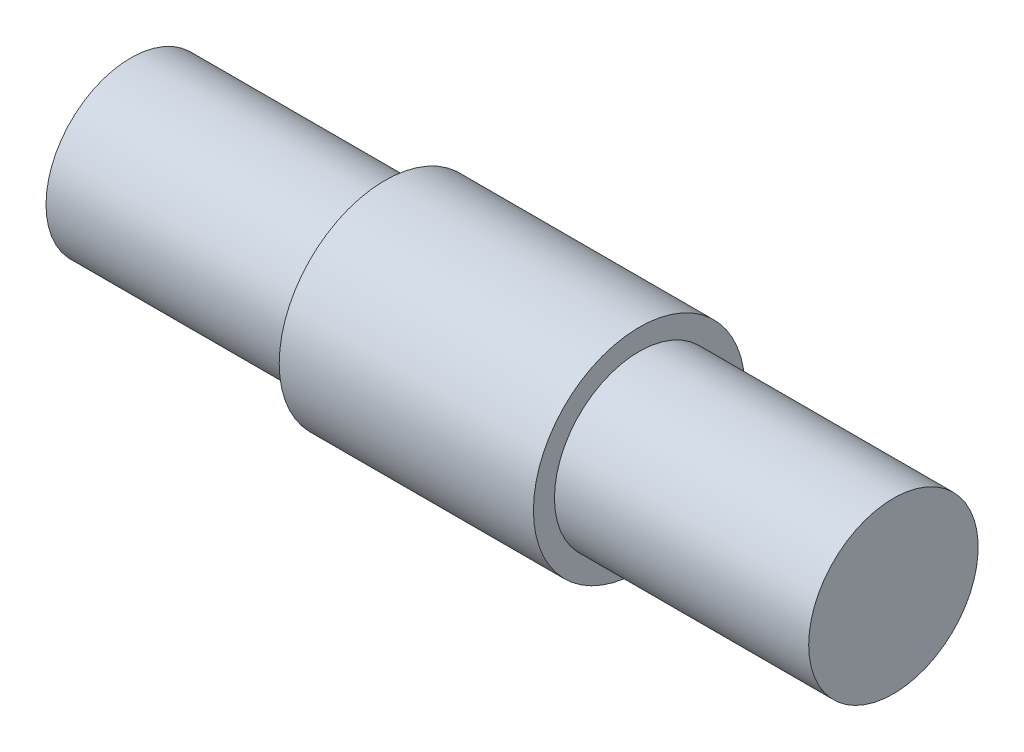
ISO-10303-21;
HEADER;
FILE_DESCRIPTION(('STEP AP214'),'2;1');
FILE_NAME('part.step','',(''),(''),'','','');
FILE_SCHEMA(('AUTOMOTIVE_DESIGN { 1 0 10303 214 1 1 1 1 }'));
ENDSEC;
DATA;
#1=APPLICATION_CONTEXT('core data for automotive mechanical design processes');
#2=APPLICATION_PROTOCOL_DEFINITION('international standard','automotive_design',2000,#1);
#3=PRODUCT_CONTEXT('',#1,'mechanical');
#4=PRODUCT('Part','Part','',(#3));
#5=PRODUCT_RELATED_PRODUCT_CATEGORY('part','',(#4));
#6=PRODUCT_DEFINITION_FORMATION('','',#4);
#7=PRODUCT_DEFINITION_CONTEXT('part definition',#1,'design');
#8=PRODUCT_DEFINITION('design','',#6,#7);
#9=PRODUCT_DEFINITION_SHAPE('','',#8);
#10=(LENGTH_UNIT() NAMED_UNIT(*) SI_UNIT(.MILLI.,.METRE.));
#11=(NAMED_UNIT(*) PLANE_ANGLE_UNIT() SI_UNIT($,.RADIAN.));
#12=(NAMED_UNIT(*) SI_UNIT($,.STERADIAN.) SOLID_ANGLE_UNIT());
#13=UNCERTAINTY_MEASURE_WITH_UNIT(LENGTH_MEASURE(1.E-05),#10,'distance_accuracy_value','');
#14=(GEOMETRIC_REPRESENTATION_CONTEXT(3) GLOBAL_UNCERTAINTY_ASSIGNED_CONTEXT((#13)) GLOBAL_UNIT_ASSIGNED_CONTEXT((#10,
#11,#12)) REPRESENTATION_CONTEXT('',''));
#15=CARTESIAN_POINT('',(0.,0.,0.));
#16=DIRECTION('',(0.,0.,1.));
#17=DIRECTION('',(1.,0.,0.));
#18=AXIS2_PLACEMENT_3D('',#15,#16,#17);
#19=CARTESIAN_POINT('',(0.,3.175,0.));
#20=DIRECTION('',(1.,0.,0.));
#21=DIRECTION('',(0.,0.,-1.));
#22=AXIS2_PLACEMENT_3D('',#19,#20,#21);
#23=PLANE('',#22);
#24=CARTESIAN_POINT('',(0.,0.,0.));
#25=DIRECTION('',(-1.,0.,0.));
#26=DIRECTION('',(0.,0.,1.));
#27=AXIS2_PLACEMENT_3D('',#24,#25,#26);
#28=CIRCLE('',#27,3.175);
#29=CARTESIAN_POINT('',(0.,0.,3.175));
#30=VERTEX_POINT('',#29);
#31=EDGE_CURVE('E53',#30,#30,#28,.T.);
#32=ORIENTED_EDGE('',*,*,#31,.T.);
#33=EDGE_LOOP('',(#32));
#34=FACE_BOUND('',#33,.T.);
#35=ADVANCED_FACE('F31',(#34),#23,.F.);
#36=CARTESIAN_POINT('',(28.575,0.,0.));
#37=DIRECTION('',(-1.,0.,0.));
#38=DIRECTION('',(0.,0.,1.));
#39=AXIS2_PLACEMENT_3D('',#36,#37,#38);
#40=PLANE('',#39);
#41=CARTESIAN_POINT('',(28.575,0.,0.));
#42=DIRECTION('',(-1.,0.,0.));
#43=DIRECTION('',(0.,0.,1.));
#44=AXIS2_PLACEMENT_3D('',#41,#42,#43);
#45=CIRCLE('',#44,3.175);
#46=CARTESIAN_POINT('',(28.575,0.,3.175));
#47=VERTEX_POINT('',#46);
#48=EDGE_CURVE('E10',#47,#47,#45,.T.);
#49=ORIENTED_EDGE('',*,*,#48,.F.);
#50=EDGE_LOOP('',(#49));
#51=FACE_BOUND('',#50,.T.);
#52=ADVANCED_FACE('F83',(#51),#40,.F.);
#53=CARTESIAN_POINT('',(0.,0.,0.));
#54=DIRECTION('',(-1.,0.,0.));
#55=DIRECTION('',(0.,0.,1.));
#56=AXIS2_PLACEMENT_3D('',#53,#54,#55);
#57=CYLINDRICAL_SURFACE('',#56,3.175);
#58=CARTESIAN_POINT('',(19.05,0.,0.));
#59=DIRECTION('',(-1.,0.,0.));
#60=DIRECTION('',(0.,0.,1.));
#61=AXIS2_PLACEMENT_3D('',#58,#59,#60);
#62=CIRCLE('',#61,3.175);
#63=CARTESIAN_POINT('',(19.05,0.,3.175));
#64=VERTEX_POINT('',#63);
#65=EDGE_CURVE('E37',#64,#64,#62,.T.);
#66=ORIENTED_EDGE('',*,*,#65,.F.);
#67=EDGE_LOOP('',(#66));
#68=FACE_BOUND('',#67,.T.);
#69=ORIENTED_EDGE('',*,*,#48,.T.);
#70=EDGE_LOOP('',(#69));
#71=FACE_BOUND('',#70,.T.);
#72=ADVANCED_FACE('F78',(#68,#71),#57,.T.);
#73=CARTESIAN_POINT('',(19.05,3.175,0.));
#74=DIRECTION('',(-1.,0.,0.));
#75=DIRECTION('',(0.,0.,1.));
#76=AXIS2_PLACEMENT_3D('',#73,#74,#75);
#77=PLANE('',#76);
#78=CARTESIAN_POINT('',(19.05,0.,0.));
#79=DIRECTION('',(-1.,0.,0.));
#80=DIRECTION('',(0.,0.,1.));
#81=AXIS2_PLACEMENT_3D('',#78,#79,#80);
#82=CIRCLE('',#81,3.9624);
#83=CARTESIAN_POINT('',(19.05,0.,3.9624));
#84=VERTEX_POINT('',#83);
#85=EDGE_CURVE('E41',#84,#84,#82,.T.);
#86=ORIENTED_EDGE('',*,*,#85,.F.);
#87=EDGE_LOOP('',(#86));
#88=FACE_BOUND('',#87,.T.);
#89=ORIENTED_EDGE('',*,*,#65,.T.);
#90=EDGE_LOOP('',(#89));
#91=FACE_BOUND('',#90,.T.);
#92=ADVANCED_FACE('F73',(#88,#91),#77,.F.);
#93=CARTESIAN_POINT('',(0.,0.,0.));
#94=DIRECTION('',(-1.,0.,0.));
#95=DIRECTION('',(0.,0.,1.));
#96=AXIS2_PLACEMENT_3D('',#93,#94,#95);
#97=CYLINDRICAL_SURFACE('',#96,3.9624);
#98=CARTESIAN_POINT('',(9.525,0.,0.));
#99=DIRECTION('',(-1.,0.,0.));
#100=DIRECTION('',(0.,0.,1.));
#101=AXIS2_PLACEMENT_3D('',#98,#99,#100);
#102=CIRCLE('',#101,3.9624);
#103=CARTESIAN_POINT('',(9.525,0.,3.9624));
#104=VERTEX_POINT('',#103);
#105=EDGE_CURVE('E45',#104,#104,#102,.T.);
#106=ORIENTED_EDGE('',*,*,#105,.F.);
#107=EDGE_LOOP('',(#106));
#108=FACE_BOUND('',#107,.T.);
#109=ORIENTED_EDGE('',*,*,#85,.T.);
#110=EDGE_LOOP('',(#109));
#111=FACE_BOUND('',#110,.T.);
#112=ADVANCED_FACE('F67',(#108,#111),#97,.T.);
#113=CARTESIAN_POINT('',(9.525,3.9624,0.));
#114=DIRECTION('',(1.,0.,0.));
#115=DIRECTION('',(0.,0.,-1.));
#116=AXIS2_PLACEMENT_3D('',#113,#114,#115);
#117=PLANE('',#116);
#118=CARTESIAN_POINT('',(9.525,0.,0.));
#119=DIRECTION('',(-1.,0.,0.));
#120=DIRECTION('',(0.,0.,1.));
#121=AXIS2_PLACEMENT_3D('',#118,#119,#120);
#122=CIRCLE('',#121,3.175);
#123=CARTESIAN_POINT('',(9.525,0.,3.175));
#124=VERTEX_POINT('',#123);
#125=EDGE_CURVE('E50',#124,#124,#122,.T.);
#126=ORIENTED_EDGE('',*,*,#125,.F.);
#127=EDGE_LOOP('',(#126));
#128=FACE_BOUND('',#127,.T.);
#129=ORIENTED_EDGE('',*,*,#105,.T.);
#130=EDGE_LOOP('',(#129));
#131=FACE_BOUND('',#130,.T.);
#132=ADVANCED_FACE('F61',(#128,#131),#117,.F.);
#133=CARTESIAN_POINT('',(0.,0.,0.));
#134=DIRECTION('',(-1.,0.,0.));
#135=DIRECTION('',(0.,0.,1.));
#136=AXIS2_PLACEMENT_3D('',#133,#134,#135);
#137=CYLINDRICAL_SURFACE('',#136,3.175);
#138=ORIENTED_EDGE('',*,*,#31,.F.);
#139=EDGE_LOOP('',(#138));
#140=FACE_BOUND('',#139,.T.);
#141=ORIENTED_EDGE('',*,*,#125,.T.);
#142=EDGE_LOOP('',(#141));
#143=FACE_BOUND('',#142,.T.);
#144=ADVANCED_FACE('F58',(#140,#143),#137,.T.);
#145=CLOSED_SHELL('',(#35,#52,#72,#92,#112,#132,#144));
#146=MANIFOLD_SOLID_BREP('B2',#145);
#147=ADVANCED_BREP_SHAPE_REPRESENTATION('',(#18,#146),#14);
#148=SHAPE_DEFINITION_REPRESENTATION(#9,#147);
ENDSEC;
END-ISO-10303-21;
